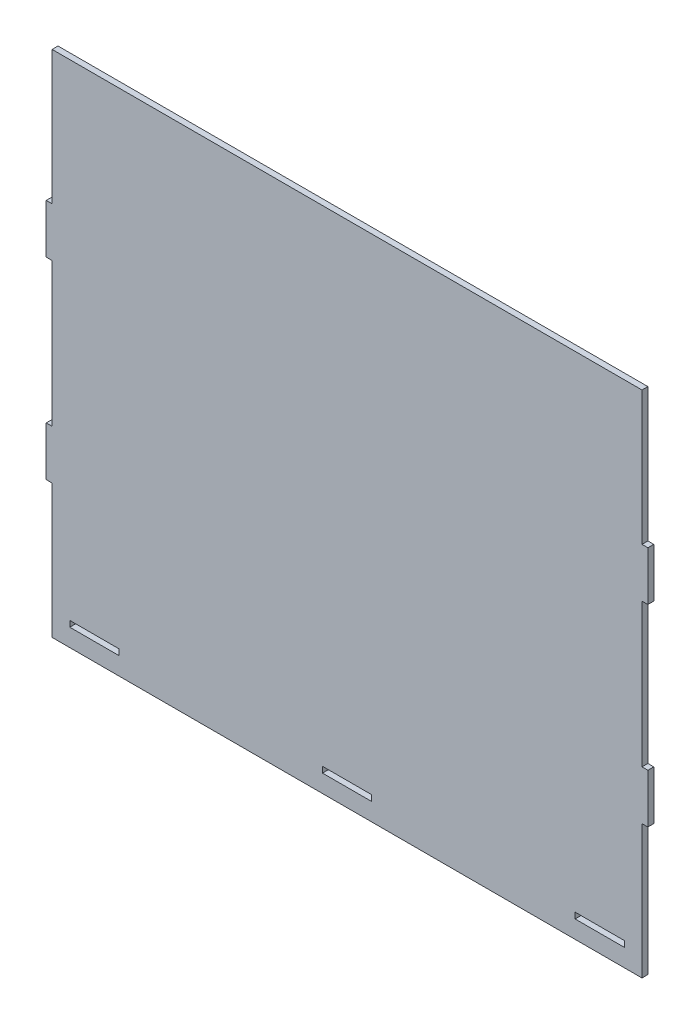
ISO-10303-21;
HEADER;
FILE_DESCRIPTION(('STEP AP214'),'2;1');
FILE_NAME('part.step','',(''),(''),'','','');
FILE_SCHEMA(('AUTOMOTIVE_DESIGN { 1 0 10303 214 1 1 1 1 }'));
ENDSEC;
DATA;
#1=APPLICATION_CONTEXT('core data for automotive mechanical design processes');
#2=APPLICATION_PROTOCOL_DEFINITION('international standard','automotive_design',2000,#1);
#3=PRODUCT_CONTEXT('',#1,'mechanical');
#4=PRODUCT('Part','Part','',(#3));
#5=PRODUCT_RELATED_PRODUCT_CATEGORY('part','',(#4));
#6=PRODUCT_DEFINITION_FORMATION('','',#4);
#7=PRODUCT_DEFINITION_CONTEXT('part definition',#1,'design');
#8=PRODUCT_DEFINITION('design','',#6,#7);
#9=PRODUCT_DEFINITION_SHAPE('','',#8);
#10=(LENGTH_UNIT() NAMED_UNIT(*) SI_UNIT(.MILLI.,.METRE.));
#11=(NAMED_UNIT(*) PLANE_ANGLE_UNIT() SI_UNIT($,.RADIAN.));
#12=(NAMED_UNIT(*) SI_UNIT($,.STERADIAN.) SOLID_ANGLE_UNIT());
#13=UNCERTAINTY_MEASURE_WITH_UNIT(LENGTH_MEASURE(1.E-05),#10,'distance_accuracy_value','');
#14=(GEOMETRIC_REPRESENTATION_CONTEXT(3) GLOBAL_UNCERTAINTY_ASSIGNED_CONTEXT((#13)) GLOBAL_UNIT_ASSIGNED_CONTEXT((#10,
#11,#12)) REPRESENTATION_CONTEXT('',''));
#15=CARTESIAN_POINT('',(0.,0.,0.));
#16=DIRECTION('',(0.,0.,1.));
#17=DIRECTION('',(1.,0.,0.));
#18=AXIS2_PLACEMENT_3D('',#15,#16,#17);
#19=CARTESIAN_POINT('',(0.,0.,6.));
#20=DIRECTION('',(0.,0.,1.));
#21=DIRECTION('',(1.,0.,0.));
#22=AXIS2_PLACEMENT_3D('',#19,#20,#21);
#23=PLANE('',#22);
#24=DIRECTION('',(0.,1.,0.));
#25=VECTOR('',#24,1.);
#26=CARTESIAN_POINT('',(300.,-123.,6.));
#27=LINE('',#26,#25);
#28=CARTESIAN_POINT('',(300.,-259.,6.));
#29=VERTEX_POINT('',#28);
#30=CARTESIAN_POINT('',(300.,-123.,6.));
#31=VERTEX_POINT('',#30);
#32=EDGE_CURVE('E340',#29,#31,#27,.T.);
#33=ORIENTED_EDGE('',*,*,#32,.T.);
#34=DIRECTION('',(1.,0.,0.));
#35=VECTOR('',#34,1.);
#36=CARTESIAN_POINT('',(306.,-123.,6.));
#37=LINE('',#36,#35);
#38=CARTESIAN_POINT('',(306.,-123.,6.));
#39=VERTEX_POINT('',#38);
#40=EDGE_CURVE('E343',#31,#39,#37,.T.);
#41=ORIENTED_EDGE('',*,*,#40,.T.);
#42=DIRECTION('',(0.,1.,0.));
#43=VECTOR('',#42,1.);
#44=CARTESIAN_POINT('',(306.,-123.,6.));
#45=LINE('',#44,#43);
#46=CARTESIAN_POINT('',(306.,-73.0000000000001,6.));
#47=VERTEX_POINT('',#46);
#48=EDGE_CURVE('E346',#39,#47,#45,.T.);
#49=ORIENTED_EDGE('',*,*,#48,.T.);
#50=DIRECTION('',(-1.,0.,0.));
#51=VECTOR('',#50,1.);
#52=CARTESIAN_POINT('',(306.,-73.0000000000001,6.));
#53=LINE('',#52,#51);
#54=CARTESIAN_POINT('',(300.,-73.0000000000002,6.));
#55=VERTEX_POINT('',#54);
#56=EDGE_CURVE('E348',#47,#55,#53,.T.);
#57=ORIENTED_EDGE('',*,*,#56,.T.);
#58=DIRECTION('',(0.,1.,0.));
#59=VECTOR('',#58,1.);
#60=CARTESIAN_POINT('',(300.,73.0000000000001,6.));
#61=LINE('',#60,#59);
#62=CARTESIAN_POINT('',(300.,73.0000000000001,6.));
#63=VERTEX_POINT('',#62);
#64=EDGE_CURVE('E350',#55,#63,#61,.T.);
#65=ORIENTED_EDGE('',*,*,#64,.T.);
#66=DIRECTION('',(1.,0.,0.));
#67=VECTOR('',#66,1.);
#68=CARTESIAN_POINT('',(306.,73.0000000000001,6.));
#69=LINE('',#68,#67);
#70=CARTESIAN_POINT('',(306.,73.0000000000001,6.));
#71=VERTEX_POINT('',#70);
#72=EDGE_CURVE('E352',#63,#71,#69,.T.);
#73=ORIENTED_EDGE('',*,*,#72,.T.);
#74=DIRECTION('',(0.,1.,0.));
#75=VECTOR('',#74,1.);
#76=CARTESIAN_POINT('',(306.,123.,6.));
#77=LINE('',#76,#75);
#78=CARTESIAN_POINT('',(306.,123.,6.));
#79=VERTEX_POINT('',#78);
#80=EDGE_CURVE('E354',#71,#79,#77,.T.);
#81=ORIENTED_EDGE('',*,*,#80,.T.);
#82=DIRECTION('',(-1.,0.,0.));
#83=VECTOR('',#82,1.);
#84=CARTESIAN_POINT('',(306.,123.,6.));
#85=LINE('',#84,#83);
#86=CARTESIAN_POINT('',(300.,123.,6.));
#87=VERTEX_POINT('',#86);
#88=EDGE_CURVE('E356',#79,#87,#85,.T.);
#89=ORIENTED_EDGE('',*,*,#88,.T.);
#90=DIRECTION('',(0.,1.,0.));
#91=VECTOR('',#90,1.);
#92=CARTESIAN_POINT('',(300.,259.,6.));
#93=LINE('',#92,#91);
#94=CARTESIAN_POINT('',(300.,259.,6.));
#95=VERTEX_POINT('',#94);
#96=EDGE_CURVE('E358',#87,#95,#93,.T.);
#97=ORIENTED_EDGE('',*,*,#96,.T.);
#98=DIRECTION('',(-1.,0.,0.));
#99=VECTOR('',#98,1.);
#100=CARTESIAN_POINT('',(-300.,259.,6.));
#101=LINE('',#100,#99);
#102=CARTESIAN_POINT('',(-300.,259.,6.));
#103=VERTEX_POINT('',#102);
#104=EDGE_CURVE('E360',#95,#103,#101,.T.);
#105=ORIENTED_EDGE('',*,*,#104,.T.);
#106=DIRECTION('',(0.,-1.,0.));
#107=VECTOR('',#106,1.);
#108=CARTESIAN_POINT('',(-300.,259.,6.));
#109=LINE('',#108,#107);
#110=CARTESIAN_POINT('',(-300.,123.,6.));
#111=VERTEX_POINT('',#110);
#112=EDGE_CURVE('E362',#103,#111,#109,.T.);
#113=ORIENTED_EDGE('',*,*,#112,.T.);
#114=DIRECTION('',(-1.,0.,0.));
#115=VECTOR('',#114,1.);
#116=CARTESIAN_POINT('',(-306.,123.,6.));
#117=LINE('',#116,#115);
#118=CARTESIAN_POINT('',(-306.,123.,6.));
#119=VERTEX_POINT('',#118);
#120=EDGE_CURVE('E364',#111,#119,#117,.T.);
#121=ORIENTED_EDGE('',*,*,#120,.T.);
#122=DIRECTION('',(0.,-1.,0.));
#123=VECTOR('',#122,1.);
#124=CARTESIAN_POINT('',(-306.,123.,6.));
#125=LINE('',#124,#123);
#126=CARTESIAN_POINT('',(-306.,73.0000000000001,6.));
#127=VERTEX_POINT('',#126);
#128=EDGE_CURVE('E366',#119,#127,#125,.T.);
#129=ORIENTED_EDGE('',*,*,#128,.T.);
#130=DIRECTION('',(1.,0.,0.));
#131=VECTOR('',#130,1.);
#132=CARTESIAN_POINT('',(-306.,73.0000000000001,6.));
#133=LINE('',#132,#131);
#134=CARTESIAN_POINT('',(-300.,73.0000000000001,6.));
#135=VERTEX_POINT('',#134);
#136=EDGE_CURVE('E368',#127,#135,#133,.T.);
#137=ORIENTED_EDGE('',*,*,#136,.T.);
#138=DIRECTION('',(0.,-1.,0.));
#139=VECTOR('',#138,1.);
#140=CARTESIAN_POINT('',(-300.,73.0000000000001,6.));
#141=LINE('',#140,#139);
#142=CARTESIAN_POINT('',(-300.,-73.0000000000002,6.));
#143=VERTEX_POINT('',#142);
#144=EDGE_CURVE('E370',#135,#143,#141,.T.);
#145=ORIENTED_EDGE('',*,*,#144,.T.);
#146=DIRECTION('',(-1.,0.,0.));
#147=VECTOR('',#146,1.);
#148=CARTESIAN_POINT('',(-306.,-73.0000000000002,6.));
#149=LINE('',#148,#147);
#150=CARTESIAN_POINT('',(-306.,-73.0000000000002,6.));
#151=VERTEX_POINT('',#150);
#152=EDGE_CURVE('E372',#143,#151,#149,.T.);
#153=ORIENTED_EDGE('',*,*,#152,.T.);
#154=DIRECTION('',(0.,-1.,0.));
#155=VECTOR('',#154,1.);
#156=CARTESIAN_POINT('',(-306.,-123.,6.));
#157=LINE('',#156,#155);
#158=CARTESIAN_POINT('',(-306.,-123.,6.));
#159=VERTEX_POINT('',#158);
#160=EDGE_CURVE('E374',#151,#159,#157,.T.);
#161=ORIENTED_EDGE('',*,*,#160,.T.);
#162=DIRECTION('',(1.,0.,0.));
#163=VECTOR('',#162,1.);
#164=CARTESIAN_POINT('',(-306.,-123.,6.));
#165=LINE('',#164,#163);
#166=CARTESIAN_POINT('',(-300.,-123.,6.));
#167=VERTEX_POINT('',#166);
#168=EDGE_CURVE('E376',#159,#167,#165,.T.);
#169=ORIENTED_EDGE('',*,*,#168,.T.);
#170=DIRECTION('',(0.,-1.,0.));
#171=VECTOR('',#170,1.);
#172=CARTESIAN_POINT('',(-300.,-123.,6.));
#173=LINE('',#172,#171);
#174=CARTESIAN_POINT('',(-300.,-259.,6.));
#175=VERTEX_POINT('',#174);
#176=EDGE_CURVE('E378',#167,#175,#173,.T.);
#177=ORIENTED_EDGE('',*,*,#176,.T.);
#178=DIRECTION('',(1.,0.,0.));
#179=VECTOR('',#178,1.);
#180=CARTESIAN_POINT('',(-300.,-259.,6.));
#181=LINE('',#180,#179);
#182=EDGE_CURVE('E380',#175,#29,#181,.T.);
#183=ORIENTED_EDGE('',*,*,#182,.T.);
#184=EDGE_LOOP('',(#33,#41,#49,#57,#65,#73,#81,#89,#97,#105,#113,#121,#129,#137,#145,#153,#161,
#169,#177,#183));
#185=FACE_BOUND('',#184,.T.);
#186=DIRECTION('',(-1.,0.,0.));
#187=VECTOR('',#186,1.);
#188=CARTESIAN_POINT('',(-282.,-235.,6.));
#189=LINE('',#188,#187);
#190=CARTESIAN_POINT('',(-232.,-235.,6.));
#191=VERTEX_POINT('',#190);
#192=CARTESIAN_POINT('',(-282.,-235.,6.));
#193=VERTEX_POINT('',#192);
#194=EDGE_CURVE('E311',#191,#193,#189,.T.);
#195=ORIENTED_EDGE('',*,*,#194,.F.);
#196=DIRECTION('',(0.,1.,0.));
#197=VECTOR('',#196,1.);
#198=CARTESIAN_POINT('',(-232.,-235.,6.));
#199=LINE('',#198,#197);
#200=CARTESIAN_POINT('',(-232.,-241.,6.));
#201=VERTEX_POINT('',#200);
#202=EDGE_CURVE('E309',#201,#191,#199,.T.);
#203=ORIENTED_EDGE('',*,*,#202,.F.);
#204=DIRECTION('',(1.,0.,0.));
#205=VECTOR('',#204,1.);
#206=CARTESIAN_POINT('',(-282.,-241.,6.));
#207=LINE('',#206,#205);
#208=CARTESIAN_POINT('',(-282.,-241.,6.));
#209=VERTEX_POINT('',#208);
#210=EDGE_CURVE('E317',#209,#201,#207,.T.);
#211=ORIENTED_EDGE('',*,*,#210,.F.);
#212=DIRECTION('',(0.,-1.,0.));
#213=VECTOR('',#212,1.);
#214=CARTESIAN_POINT('',(-282.,-235.,6.));
#215=LINE('',#214,#213);
#216=EDGE_CURVE('E314',#193,#209,#215,.T.);
#217=ORIENTED_EDGE('',*,*,#216,.F.);
#218=EDGE_LOOP('',(#195,#203,#211,#217));
#219=FACE_BOUND('',#218,.T.);
#220=DIRECTION('',(-1.,0.,0.));
#221=VECTOR('',#220,1.);
#222=CARTESIAN_POINT('',(282.,-235.,6.));
#223=LINE('',#222,#221);
#224=CARTESIAN_POINT('',(282.,-235.,6.));
#225=VERTEX_POINT('',#224);
#226=CARTESIAN_POINT('',(232.,-235.,6.));
#227=VERTEX_POINT('',#226);
#228=EDGE_CURVE('E280',#225,#227,#223,.T.);
#229=ORIENTED_EDGE('',*,*,#228,.F.);
#230=DIRECTION('',(0.,1.,0.));
#231=VECTOR('',#230,1.);
#232=CARTESIAN_POINT('',(282.,-235.,6.));
#233=LINE('',#232,#231);
#234=CARTESIAN_POINT('',(282.,-241.,6.));
#235=VERTEX_POINT('',#234);
#236=EDGE_CURVE('E278',#235,#225,#233,.T.);
#237=ORIENTED_EDGE('',*,*,#236,.F.);
#238=DIRECTION('',(1.,0.,0.));
#239=VECTOR('',#238,1.);
#240=CARTESIAN_POINT('',(282.,-241.,6.));
#241=LINE('',#240,#239);
#242=CARTESIAN_POINT('',(232.,-241.,6.));
#243=VERTEX_POINT('',#242);
#244=EDGE_CURVE('E286',#243,#235,#241,.T.);
#245=ORIENTED_EDGE('',*,*,#244,.F.);
#246=DIRECTION('',(0.,-1.,0.));
#247=VECTOR('',#246,1.);
#248=CARTESIAN_POINT('',(232.,-235.,6.));
#249=LINE('',#248,#247);
#250=EDGE_CURVE('E283',#227,#243,#249,.T.);
#251=ORIENTED_EDGE('',*,*,#250,.F.);
#252=EDGE_LOOP('',(#229,#237,#245,#251));
#253=FACE_BOUND('',#252,.T.);
#254=DIRECTION('',(-1.,0.,0.));
#255=VECTOR('',#254,1.);
#256=CARTESIAN_POINT('',(-24.9999999999998,-235.,6.));
#257=LINE('',#256,#255);
#258=CARTESIAN_POINT('',(25.0000000000002,-235.,6.));
#259=VERTEX_POINT('',#258);
#260=CARTESIAN_POINT('',(-24.9999999999998,-235.,6.));
#261=VERTEX_POINT('',#260);
#262=EDGE_CURVE('E250',#259,#261,#257,.T.);
#263=ORIENTED_EDGE('',*,*,#262,.F.);
#264=DIRECTION('',(0.,1.,0.));
#265=VECTOR('',#264,1.);
#266=CARTESIAN_POINT('',(25.0000000000002,-235.,6.));
#267=LINE('',#266,#265);
#268=CARTESIAN_POINT('',(25.0000000000002,-241.,6.));
#269=VERTEX_POINT('',#268);
#270=EDGE_CURVE('E242',#269,#259,#267,.T.);
#271=ORIENTED_EDGE('',*,*,#270,.F.);
#272=DIRECTION('',(1.,0.,0.));
#273=VECTOR('',#272,1.);
#274=CARTESIAN_POINT('',(-24.9999999999998,-241.,6.));
#275=LINE('',#274,#273);
#276=CARTESIAN_POINT('',(-24.9999999999998,-241.,6.));
#277=VERTEX_POINT('',#276);
#278=EDGE_CURVE('E264',#277,#269,#275,.T.);
#279=ORIENTED_EDGE('',*,*,#278,.F.);
#280=DIRECTION('',(0.,-1.,0.));
#281=VECTOR('',#280,1.);
#282=CARTESIAN_POINT('',(-24.9999999999998,-235.,6.));
#283=LINE('',#282,#281);
#284=EDGE_CURVE('E262',#261,#277,#283,.T.);
#285=ORIENTED_EDGE('',*,*,#284,.F.);
#286=EDGE_LOOP('',(#263,#271,#279,#285));
#287=FACE_BOUND('',#286,.T.);
#288=ADVANCED_FACE('F33',(#185,#219,#253,#287),#23,.T.);
#289=CARTESIAN_POINT('',(0.,0.,0.));
#290=DIRECTION('',(0.,0.,1.));
#291=DIRECTION('',(1.,0.,0.));
#292=AXIS2_PLACEMENT_3D('',#289,#290,#291);
#293=PLANE('',#292);
#294=DIRECTION('',(0.,1.,0.));
#295=VECTOR('',#294,1.);
#296=CARTESIAN_POINT('',(282.,-235.,0.));
#297=LINE('',#296,#295);
#298=CARTESIAN_POINT('',(282.,-241.,0.));
#299=VERTEX_POINT('',#298);
#300=CARTESIAN_POINT('',(282.,-235.,0.));
#301=VERTEX_POINT('',#300);
#302=EDGE_CURVE('E258',#299,#301,#297,.T.);
#303=ORIENTED_EDGE('',*,*,#302,.T.);
#304=DIRECTION('',(-1.,0.,0.));
#305=VECTOR('',#304,1.);
#306=CARTESIAN_POINT('',(282.,-235.,0.));
#307=LINE('',#306,#305);
#308=CARTESIAN_POINT('',(232.,-235.,0.));
#309=VERTEX_POINT('',#308);
#310=EDGE_CURVE('E291',#301,#309,#307,.T.);
#311=ORIENTED_EDGE('',*,*,#310,.T.);
#312=DIRECTION('',(0.,-1.,0.));
#313=VECTOR('',#312,1.);
#314=CARTESIAN_POINT('',(232.,-235.,0.));
#315=LINE('',#314,#313);
#316=CARTESIAN_POINT('',(232.,-241.,0.));
#317=VERTEX_POINT('',#316);
#318=EDGE_CURVE('E294',#309,#317,#315,.T.);
#319=ORIENTED_EDGE('',*,*,#318,.T.);
#320=DIRECTION('',(1.,0.,0.));
#321=VECTOR('',#320,1.);
#322=CARTESIAN_POINT('',(282.,-241.,0.));
#323=LINE('',#322,#321);
#324=EDGE_CURVE('E281',#317,#299,#323,.T.);
#325=ORIENTED_EDGE('',*,*,#324,.T.);
#326=EDGE_LOOP('',(#303,#311,#319,#325));
#327=FACE_BOUND('',#326,.T.);
#328=DIRECTION('',(0.,1.,0.));
#329=VECTOR('',#328,1.);
#330=CARTESIAN_POINT('',(300.,-123.,0.));
#331=LINE('',#330,#329);
#332=CARTESIAN_POINT('',(300.,-259.,0.));
#333=VERTEX_POINT('',#332);
#334=CARTESIAN_POINT('',(300.,-123.,0.));
#335=VERTEX_POINT('',#334);
#336=EDGE_CURVE('E339',#333,#335,#331,.T.);
#337=ORIENTED_EDGE('',*,*,#336,.F.);
#338=DIRECTION('',(1.,0.,0.));
#339=VECTOR('',#338,1.);
#340=CARTESIAN_POINT('',(-300.,-259.,0.));
#341=LINE('',#340,#339);
#342=CARTESIAN_POINT('',(-300.,-259.,0.));
#343=VERTEX_POINT('',#342);
#344=EDGE_CURVE('E344',#343,#333,#341,.T.);
#345=ORIENTED_EDGE('',*,*,#344,.F.);
#346=DIRECTION('',(0.,-1.,0.));
#347=VECTOR('',#346,1.);
#348=CARTESIAN_POINT('',(-300.,-123.,0.));
#349=LINE('',#348,#347);
#350=CARTESIAN_POINT('',(-300.,-123.,0.));
#351=VERTEX_POINT('',#350);
#352=EDGE_CURVE('E419',#351,#343,#349,.T.);
#353=ORIENTED_EDGE('',*,*,#352,.F.);
#354=DIRECTION('',(1.,0.,0.));
#355=VECTOR('',#354,1.);
#356=CARTESIAN_POINT('',(-306.,-123.,0.));
#357=LINE('',#356,#355);
#358=CARTESIAN_POINT('',(-306.,-123.,0.));
#359=VERTEX_POINT('',#358);
#360=EDGE_CURVE('E417',#359,#351,#357,.T.);
#361=ORIENTED_EDGE('',*,*,#360,.F.);
#362=DIRECTION('',(0.,-1.,0.));
#363=VECTOR('',#362,1.);
#364=CARTESIAN_POINT('',(-306.,-123.,0.));
#365=LINE('',#364,#363);
#366=CARTESIAN_POINT('',(-306.,-73.0000000000002,0.));
#367=VERTEX_POINT('',#366);
#368=EDGE_CURVE('E415',#367,#359,#365,.T.);
#369=ORIENTED_EDGE('',*,*,#368,.F.);
#370=DIRECTION('',(-1.,0.,0.));
#371=VECTOR('',#370,1.);
#372=CARTESIAN_POINT('',(-306.,-73.0000000000002,0.));
#373=LINE('',#372,#371);
#374=CARTESIAN_POINT('',(-300.,-73.0000000000002,0.));
#375=VERTEX_POINT('',#374);
#376=EDGE_CURVE('E413',#375,#367,#373,.T.);
#377=ORIENTED_EDGE('',*,*,#376,.F.);
#378=DIRECTION('',(0.,-1.,0.));
#379=VECTOR('',#378,1.);
#380=CARTESIAN_POINT('',(-300.,73.0000000000001,0.));
#381=LINE('',#380,#379);
#382=CARTESIAN_POINT('',(-300.,73.0000000000001,0.));
#383=VERTEX_POINT('',#382);
#384=EDGE_CURVE('E411',#383,#375,#381,.T.);
#385=ORIENTED_EDGE('',*,*,#384,.F.);
#386=DIRECTION('',(1.,0.,0.));
#387=VECTOR('',#386,1.);
#388=CARTESIAN_POINT('',(-306.,73.0000000000001,0.));
#389=LINE('',#388,#387);
#390=CARTESIAN_POINT('',(-306.,73.0000000000001,0.));
#391=VERTEX_POINT('',#390);
#392=EDGE_CURVE('E409',#391,#383,#389,.T.);
#393=ORIENTED_EDGE('',*,*,#392,.F.);
#394=DIRECTION('',(0.,-1.,0.));
#395=VECTOR('',#394,1.);
#396=CARTESIAN_POINT('',(-306.,123.,0.));
#397=LINE('',#396,#395);
#398=CARTESIAN_POINT('',(-306.,123.,0.));
#399=VERTEX_POINT('',#398);
#400=EDGE_CURVE('E407',#399,#391,#397,.T.);
#401=ORIENTED_EDGE('',*,*,#400,.F.);
#402=DIRECTION('',(-1.,0.,0.));
#403=VECTOR('',#402,1.);
#404=CARTESIAN_POINT('',(-306.,123.,0.));
#405=LINE('',#404,#403);
#406=CARTESIAN_POINT('',(-300.,123.,0.));
#407=VERTEX_POINT('',#406);
#408=EDGE_CURVE('E405',#407,#399,#405,.T.);
#409=ORIENTED_EDGE('',*,*,#408,.F.);
#410=DIRECTION('',(0.,-1.,0.));
#411=VECTOR('',#410,1.);
#412=CARTESIAN_POINT('',(-300.,259.,0.));
#413=LINE('',#412,#411);
#414=CARTESIAN_POINT('',(-300.,259.,0.));
#415=VERTEX_POINT('',#414);
#416=EDGE_CURVE('E403',#415,#407,#413,.T.);
#417=ORIENTED_EDGE('',*,*,#416,.F.);
#418=DIRECTION('',(-1.,0.,0.));
#419=VECTOR('',#418,1.);
#420=CARTESIAN_POINT('',(-300.,259.,0.));
#421=LINE('',#420,#419);
#422=CARTESIAN_POINT('',(300.,259.,0.));
#423=VERTEX_POINT('',#422);
#424=EDGE_CURVE('E401',#423,#415,#421,.T.);
#425=ORIENTED_EDGE('',*,*,#424,.F.);
#426=DIRECTION('',(0.,1.,0.));
#427=VECTOR('',#426,1.);
#428=CARTESIAN_POINT('',(300.,259.,0.));
#429=LINE('',#428,#427);
#430=CARTESIAN_POINT('',(300.,123.,0.));
#431=VERTEX_POINT('',#430);
#432=EDGE_CURVE('E399',#431,#423,#429,.T.);
#433=ORIENTED_EDGE('',*,*,#432,.F.);
#434=DIRECTION('',(-1.,0.,0.));
#435=VECTOR('',#434,1.);
#436=CARTESIAN_POINT('',(306.,123.,0.));
#437=LINE('',#436,#435);
#438=CARTESIAN_POINT('',(306.,123.,0.));
#439=VERTEX_POINT('',#438);
#440=EDGE_CURVE('E397',#439,#431,#437,.T.);
#441=ORIENTED_EDGE('',*,*,#440,.F.);
#442=DIRECTION('',(0.,1.,0.));
#443=VECTOR('',#442,1.);
#444=CARTESIAN_POINT('',(306.,123.,0.));
#445=LINE('',#444,#443);
#446=CARTESIAN_POINT('',(306.,73.0000000000001,0.));
#447=VERTEX_POINT('',#446);
#448=EDGE_CURVE('E395',#447,#439,#445,.T.);
#449=ORIENTED_EDGE('',*,*,#448,.F.);
#450=DIRECTION('',(1.,0.,0.));
#451=VECTOR('',#450,1.);
#452=CARTESIAN_POINT('',(306.,73.0000000000001,0.));
#453=LINE('',#452,#451);
#454=CARTESIAN_POINT('',(300.,73.0000000000001,0.));
#455=VERTEX_POINT('',#454);
#456=EDGE_CURVE('E393',#455,#447,#453,.T.);
#457=ORIENTED_EDGE('',*,*,#456,.F.);
#458=DIRECTION('',(0.,1.,0.));
#459=VECTOR('',#458,1.);
#460=CARTESIAN_POINT('',(300.,73.0000000000001,0.));
#461=LINE('',#460,#459);
#462=CARTESIAN_POINT('',(300.,-73.0000000000002,0.));
#463=VERTEX_POINT('',#462);
#464=EDGE_CURVE('E391',#463,#455,#461,.T.);
#465=ORIENTED_EDGE('',*,*,#464,.F.);
#466=DIRECTION('',(-1.,0.,0.));
#467=VECTOR('',#466,1.);
#468=CARTESIAN_POINT('',(306.,-73.0000000000001,0.));
#469=LINE('',#468,#467);
#470=CARTESIAN_POINT('',(306.,-73.0000000000001,0.));
#471=VERTEX_POINT('',#470);
#472=EDGE_CURVE('E389',#471,#463,#469,.T.);
#473=ORIENTED_EDGE('',*,*,#472,.F.);
#474=DIRECTION('',(0.,1.,0.));
#475=VECTOR('',#474,1.);
#476=CARTESIAN_POINT('',(306.,-123.,0.));
#477=LINE('',#476,#475);
#478=CARTESIAN_POINT('',(306.,-123.,0.));
#479=VERTEX_POINT('',#478);
#480=EDGE_CURVE('E387',#479,#471,#477,.T.);
#481=ORIENTED_EDGE('',*,*,#480,.F.);
#482=DIRECTION('',(1.,0.,0.));
#483=VECTOR('',#482,1.);
#484=CARTESIAN_POINT('',(306.,-123.,0.));
#485=LINE('',#484,#483);
#486=EDGE_CURVE('E385',#335,#479,#485,.T.);
#487=ORIENTED_EDGE('',*,*,#486,.F.);
#488=EDGE_LOOP('',(#337,#345,#353,#361,#369,#377,#385,#393,#401,#409,#417,#425,#433,#441,#449,
#457,#465,#473,#481,#487));
#489=FACE_BOUND('',#488,.T.);
#490=DIRECTION('',(0.,1.,0.));
#491=VECTOR('',#490,1.);
#492=CARTESIAN_POINT('',(-232.,-235.,0.));
#493=LINE('',#492,#491);
#494=CARTESIAN_POINT('',(-232.,-241.,0.));
#495=VERTEX_POINT('',#494);
#496=CARTESIAN_POINT('',(-232.,-235.,0.));
#497=VERTEX_POINT('',#496);
#498=EDGE_CURVE('E308',#495,#497,#493,.T.);
#499=ORIENTED_EDGE('',*,*,#498,.T.);
#500=DIRECTION('',(-1.,0.,0.));
#501=VECTOR('',#500,1.);
#502=CARTESIAN_POINT('',(-282.,-235.,0.));
#503=LINE('',#502,#501);
#504=CARTESIAN_POINT('',(-282.,-235.,0.));
#505=VERTEX_POINT('',#504);
#506=EDGE_CURVE('E322',#497,#505,#503,.T.);
#507=ORIENTED_EDGE('',*,*,#506,.T.);
#508=DIRECTION('',(0.,-1.,0.));
#509=VECTOR('',#508,1.);
#510=CARTESIAN_POINT('',(-282.,-235.,0.));
#511=LINE('',#510,#509);
#512=CARTESIAN_POINT('',(-282.,-241.,0.));
#513=VERTEX_POINT('',#512);
#514=EDGE_CURVE('E325',#505,#513,#511,.T.);
#515=ORIENTED_EDGE('',*,*,#514,.T.);
#516=DIRECTION('',(1.,0.,0.));
#517=VECTOR('',#516,1.);
#518=CARTESIAN_POINT('',(-282.,-241.,0.));
#519=LINE('',#518,#517);
#520=EDGE_CURVE('E312',#513,#495,#519,.T.);
#521=ORIENTED_EDGE('',*,*,#520,.T.);
#522=EDGE_LOOP('',(#499,#507,#515,#521));
#523=FACE_BOUND('',#522,.T.);
#524=DIRECTION('',(0.,1.,0.));
#525=VECTOR('',#524,1.);
#526=CARTESIAN_POINT('',(25.0000000000002,-235.,0.));
#527=LINE('',#526,#525);
#528=CARTESIAN_POINT('',(25.0000000000002,-241.,0.));
#529=VERTEX_POINT('',#528);
#530=CARTESIAN_POINT('',(25.0000000000002,-235.,0.));
#531=VERTEX_POINT('',#530);
#532=EDGE_CURVE('E56',#529,#531,#527,.T.);
#533=ORIENTED_EDGE('',*,*,#532,.T.);
#534=DIRECTION('',(-1.,0.,0.));
#535=VECTOR('',#534,1.);
#536=CARTESIAN_POINT('',(-24.9999999999998,-235.,0.));
#537=LINE('',#536,#535);
#538=CARTESIAN_POINT('',(-24.9999999999998,-235.,0.));
#539=VERTEX_POINT('',#538);
#540=EDGE_CURVE('E257',#531,#539,#537,.T.);
#541=ORIENTED_EDGE('',*,*,#540,.T.);
#542=DIRECTION('',(0.,-1.,0.));
#543=VECTOR('',#542,1.);
#544=CARTESIAN_POINT('',(-24.9999999999998,-235.,0.));
#545=LINE('',#544,#543);
#546=CARTESIAN_POINT('',(-24.9999999999998,-241.,0.));
#547=VERTEX_POINT('',#546);
#548=EDGE_CURVE('E270',#539,#547,#545,.T.);
#549=ORIENTED_EDGE('',*,*,#548,.T.);
#550=DIRECTION('',(1.,0.,0.));
#551=VECTOR('',#550,1.);
#552=CARTESIAN_POINT('',(-24.9999999999998,-241.,0.));
#553=LINE('',#552,#551);
#554=EDGE_CURVE('E251',#547,#529,#553,.T.);
#555=ORIENTED_EDGE('',*,*,#554,.T.);
#556=EDGE_LOOP('',(#533,#541,#549,#555));
#557=FACE_BOUND('',#556,.T.);
#558=ADVANCED_FACE('F485',(#327,#489,#523,#557),#293,.F.);
#559=CARTESIAN_POINT('',(300.,-123.,6.));
#560=DIRECTION('',(-1.,0.,0.));
#561=DIRECTION('',(0.,-1.,0.));
#562=AXIS2_PLACEMENT_3D('',#559,#560,#561);
#563=PLANE('',#562);
#564=ORIENTED_EDGE('',*,*,#336,.T.);
#565=DIRECTION('',(0.,0.,-1.));
#566=VECTOR('',#565,1.);
#567=CARTESIAN_POINT('',(300.,-123.,6.));
#568=LINE('',#567,#566);
#569=EDGE_CURVE('E11',#31,#335,#568,.T.);
#570=ORIENTED_EDGE('',*,*,#569,.F.);
#571=ORIENTED_EDGE('',*,*,#32,.F.);
#572=DIRECTION('',(0.,0.,-1.));
#573=VECTOR('',#572,1.);
#574=CARTESIAN_POINT('',(300.,-259.,6.));
#575=LINE('',#574,#573);
#576=EDGE_CURVE('E382',#29,#333,#575,.T.);
#577=ORIENTED_EDGE('',*,*,#576,.T.);
#578=EDGE_LOOP('',(#564,#570,#571,#577));
#579=FACE_BOUND('',#578,.T.);
#580=ADVANCED_FACE('F35',(#579),#563,.F.);
#581=CARTESIAN_POINT('',(306.,-123.,6.));
#582=DIRECTION('',(0.,1.,0.));
#583=DIRECTION('',(-1.,0.,0.));
#584=AXIS2_PLACEMENT_3D('',#581,#582,#583);
#585=PLANE('',#584);
#586=ORIENTED_EDGE('',*,*,#486,.T.);
#587=DIRECTION('',(0.,0.,-1.));
#588=VECTOR('',#587,1.);
#589=CARTESIAN_POINT('',(306.,-123.,6.));
#590=LINE('',#589,#588);
#591=EDGE_CURVE('E41',#39,#479,#590,.T.);
#592=ORIENTED_EDGE('',*,*,#591,.F.);
#593=ORIENTED_EDGE('',*,*,#40,.F.);
#594=ORIENTED_EDGE('',*,*,#569,.T.);
#595=EDGE_LOOP('',(#586,#592,#593,#594));
#596=FACE_BOUND('',#595,.T.);
#597=ADVANCED_FACE('F503',(#596),#585,.F.);
#598=CARTESIAN_POINT('',(306.,-123.,6.));
#599=DIRECTION('',(-1.,0.,0.));
#600=DIRECTION('',(0.,0.,1.));
#601=AXIS2_PLACEMENT_3D('',#598,#599,#600);
#602=PLANE('',#601);
#603=ORIENTED_EDGE('',*,*,#480,.T.);
#604=DIRECTION('',(0.,0.,-1.));
#605=VECTOR('',#604,1.);
#606=CARTESIAN_POINT('',(306.,-73.0000000000001,6.));
#607=LINE('',#606,#605);
#608=EDGE_CURVE('E472',#47,#471,#607,.T.);
#609=ORIENTED_EDGE('',*,*,#608,.F.);
#610=ORIENTED_EDGE('',*,*,#48,.F.);
#611=ORIENTED_EDGE('',*,*,#591,.T.);
#612=EDGE_LOOP('',(#603,#609,#610,#611));
#613=FACE_BOUND('',#612,.T.);
#614=ADVANCED_FACE('F479',(#613),#602,.F.);
#615=CARTESIAN_POINT('',(306.,-73.0000000000001,6.));
#616=DIRECTION('',(0.,-1.,0.));
#617=DIRECTION('',(1.,0.,0.));
#618=AXIS2_PLACEMENT_3D('',#615,#616,#617);
#619=PLANE('',#618);
#620=ORIENTED_EDGE('',*,*,#472,.T.);
#621=DIRECTION('',(0.,0.,-1.));
#622=VECTOR('',#621,1.);
#623=CARTESIAN_POINT('',(300.,-73.0000000000002,6.));
#624=LINE('',#623,#622);
#625=EDGE_CURVE('E469',#55,#463,#624,.T.);
#626=ORIENTED_EDGE('',*,*,#625,.F.);
#627=ORIENTED_EDGE('',*,*,#56,.F.);
#628=ORIENTED_EDGE('',*,*,#608,.T.);
#629=EDGE_LOOP('',(#620,#626,#627,#628));
#630=FACE_BOUND('',#629,.T.);
#631=ADVANCED_FACE('F491',(#630),#619,.F.);
#632=CARTESIAN_POINT('',(300.,73.0000000000001,6.));
#633=DIRECTION('',(-1.,0.,0.));
#634=DIRECTION('',(0.,0.,1.));
#635=AXIS2_PLACEMENT_3D('',#632,#633,#634);
#636=PLANE('',#635);
#637=ORIENTED_EDGE('',*,*,#464,.T.);
#638=DIRECTION('',(0.,0.,-1.));
#639=VECTOR('',#638,1.);
#640=CARTESIAN_POINT('',(300.,73.0000000000001,6.));
#641=LINE('',#640,#639);
#642=EDGE_CURVE('E466',#63,#455,#641,.T.);
#643=ORIENTED_EDGE('',*,*,#642,.F.);
#644=ORIENTED_EDGE('',*,*,#64,.F.);
#645=ORIENTED_EDGE('',*,*,#625,.T.);
#646=EDGE_LOOP('',(#637,#643,#644,#645));
#647=FACE_BOUND('',#646,.T.);
#648=ADVANCED_FACE('F495',(#647),#636,.F.);
#649=CARTESIAN_POINT('',(306.,73.0000000000001,6.));
#650=DIRECTION('',(0.,1.,0.));
#651=DIRECTION('',(-1.,0.,0.));
#652=AXIS2_PLACEMENT_3D('',#649,#650,#651);
#653=PLANE('',#652);
#654=ORIENTED_EDGE('',*,*,#456,.T.);
#655=DIRECTION('',(0.,0.,-1.));
#656=VECTOR('',#655,1.);
#657=CARTESIAN_POINT('',(306.,73.0000000000001,6.));
#658=LINE('',#657,#656);
#659=EDGE_CURVE('E463',#71,#447,#658,.T.);
#660=ORIENTED_EDGE('',*,*,#659,.F.);
#661=ORIENTED_EDGE('',*,*,#72,.F.);
#662=ORIENTED_EDGE('',*,*,#642,.T.);
#663=EDGE_LOOP('',(#654,#660,#661,#662));
#664=FACE_BOUND('',#663,.T.);
#665=ADVANCED_FACE('F576',(#664),#653,.F.);
#666=CARTESIAN_POINT('',(306.,123.,6.));
#667=DIRECTION('',(-1.,0.,0.));
#668=DIRECTION('',(0.,0.,1.));
#669=AXIS2_PLACEMENT_3D('',#666,#667,#668);
#670=PLANE('',#669);
#671=ORIENTED_EDGE('',*,*,#448,.T.);
#672=DIRECTION('',(0.,0.,-1.));
#673=VECTOR('',#672,1.);
#674=CARTESIAN_POINT('',(306.,123.,6.));
#675=LINE('',#674,#673);
#676=EDGE_CURVE('E460',#79,#439,#675,.T.);
#677=ORIENTED_EDGE('',*,*,#676,.F.);
#678=ORIENTED_EDGE('',*,*,#80,.F.);
#679=ORIENTED_EDGE('',*,*,#659,.T.);
#680=EDGE_LOOP('',(#671,#677,#678,#679));
#681=FACE_BOUND('',#680,.T.);
#682=ADVANCED_FACE('F574',(#681),#670,.F.);
#683=CARTESIAN_POINT('',(306.,123.,6.));
#684=DIRECTION('',(0.,-1.,0.));
#685=DIRECTION('',(1.,0.,0.));
#686=AXIS2_PLACEMENT_3D('',#683,#684,#685);
#687=PLANE('',#686);
#688=ORIENTED_EDGE('',*,*,#440,.T.);
#689=DIRECTION('',(0.,0.,-1.));
#690=VECTOR('',#689,1.);
#691=CARTESIAN_POINT('',(300.,123.,6.));
#692=LINE('',#691,#690);
#693=EDGE_CURVE('E457',#87,#431,#692,.T.);
#694=ORIENTED_EDGE('',*,*,#693,.F.);
#695=ORIENTED_EDGE('',*,*,#88,.F.);
#696=ORIENTED_EDGE('',*,*,#676,.T.);
#697=EDGE_LOOP('',(#688,#694,#695,#696));
#698=FACE_BOUND('',#697,.T.);
#699=ADVANCED_FACE('F569',(#698),#687,.F.);
#700=CARTESIAN_POINT('',(300.,259.,6.));
#701=DIRECTION('',(-1.,0.,0.));
#702=DIRECTION('',(0.,0.,1.));
#703=AXIS2_PLACEMENT_3D('',#700,#701,#702);
#704=PLANE('',#703);
#705=ORIENTED_EDGE('',*,*,#432,.T.);
#706=DIRECTION('',(0.,0.,-1.));
#707=VECTOR('',#706,1.);
#708=CARTESIAN_POINT('',(300.,259.,6.));
#709=LINE('',#708,#707);
#710=EDGE_CURVE('E454',#95,#423,#709,.T.);
#711=ORIENTED_EDGE('',*,*,#710,.F.);
#712=ORIENTED_EDGE('',*,*,#96,.F.);
#713=ORIENTED_EDGE('',*,*,#693,.T.);
#714=EDGE_LOOP('',(#705,#711,#712,#713));
#715=FACE_BOUND('',#714,.T.);
#716=ADVANCED_FACE('F564',(#715),#704,.F.);
#717=CARTESIAN_POINT('',(-300.,259.,6.));
#718=DIRECTION('',(0.,-1.,0.));
#719=DIRECTION('',(1.,0.,0.));
#720=AXIS2_PLACEMENT_3D('',#717,#718,#719);
#721=PLANE('',#720);
#722=ORIENTED_EDGE('',*,*,#424,.T.);
#723=DIRECTION('',(0.,0.,-1.));
#724=VECTOR('',#723,1.);
#725=CARTESIAN_POINT('',(-300.,259.,6.));
#726=LINE('',#725,#724);
#727=EDGE_CURVE('E451',#103,#415,#726,.T.);
#728=ORIENTED_EDGE('',*,*,#727,.F.);
#729=ORIENTED_EDGE('',*,*,#104,.F.);
#730=ORIENTED_EDGE('',*,*,#710,.T.);
#731=EDGE_LOOP('',(#722,#728,#729,#730));
#732=FACE_BOUND('',#731,.T.);
#733=ADVANCED_FACE('F560',(#732),#721,.F.);
#734=CARTESIAN_POINT('',(-300.,259.,6.));
#735=DIRECTION('',(1.,0.,0.));
#736=DIRECTION('',(0.,1.,0.));
#737=AXIS2_PLACEMENT_3D('',#734,#735,#736);
#738=PLANE('',#737);
#739=ORIENTED_EDGE('',*,*,#416,.T.);
#740=DIRECTION('',(0.,0.,-1.));
#741=VECTOR('',#740,1.);
#742=CARTESIAN_POINT('',(-300.,123.,6.));
#743=LINE('',#742,#741);
#744=EDGE_CURVE('E448',#111,#407,#743,.T.);
#745=ORIENTED_EDGE('',*,*,#744,.F.);
#746=ORIENTED_EDGE('',*,*,#112,.F.);
#747=ORIENTED_EDGE('',*,*,#727,.T.);
#748=EDGE_LOOP('',(#739,#745,#746,#747));
#749=FACE_BOUND('',#748,.T.);
#750=ADVANCED_FACE('F555',(#749),#738,.F.);
#751=CARTESIAN_POINT('',(-306.,123.,6.));
#752=DIRECTION('',(0.,-1.,0.));
#753=DIRECTION('',(0.,0.,-1.));
#754=AXIS2_PLACEMENT_3D('',#751,#752,#753);
#755=PLANE('',#754);
#756=ORIENTED_EDGE('',*,*,#408,.T.);
#757=DIRECTION('',(0.,0.,-1.));
#758=VECTOR('',#757,1.);
#759=CARTESIAN_POINT('',(-306.,123.,6.));
#760=LINE('',#759,#758);
#761=EDGE_CURVE('E445',#119,#399,#760,.T.);
#762=ORIENTED_EDGE('',*,*,#761,.F.);
#763=ORIENTED_EDGE('',*,*,#120,.F.);
#764=ORIENTED_EDGE('',*,*,#744,.T.);
#765=EDGE_LOOP('',(#756,#762,#763,#764));
#766=FACE_BOUND('',#765,.T.);
#767=ADVANCED_FACE('F549',(#766),#755,.F.);
#768=CARTESIAN_POINT('',(-306.,123.,6.));
#769=DIRECTION('',(1.,0.,0.));
#770=DIRECTION('',(0.,0.,-1.));
#771=AXIS2_PLACEMENT_3D('',#768,#769,#770);
#772=PLANE('',#771);
#773=ORIENTED_EDGE('',*,*,#400,.T.);
#774=DIRECTION('',(0.,0.,-1.));
#775=VECTOR('',#774,1.);
#776=CARTESIAN_POINT('',(-306.,73.0000000000001,6.));
#777=LINE('',#776,#775);
#778=EDGE_CURVE('E442',#127,#391,#777,.T.);
#779=ORIENTED_EDGE('',*,*,#778,.F.);
#780=ORIENTED_EDGE('',*,*,#128,.F.);
#781=ORIENTED_EDGE('',*,*,#761,.T.);
#782=EDGE_LOOP('',(#773,#779,#780,#781));
#783=FACE_BOUND('',#782,.T.);
#784=ADVANCED_FACE('F545',(#783),#772,.F.);
#785=CARTESIAN_POINT('',(-306.,73.0000000000001,6.));
#786=DIRECTION('',(0.,1.,0.));
#787=DIRECTION('',(0.,0.,1.));
#788=AXIS2_PLACEMENT_3D('',#785,#786,#787);
#789=PLANE('',#788);
#790=ORIENTED_EDGE('',*,*,#392,.T.);
#791=DIRECTION('',(0.,0.,-1.));
#792=VECTOR('',#791,1.);
#793=CARTESIAN_POINT('',(-300.,73.0000000000001,6.));
#794=LINE('',#793,#792);
#795=EDGE_CURVE('E439',#135,#383,#794,.T.);
#796=ORIENTED_EDGE('',*,*,#795,.F.);
#797=ORIENTED_EDGE('',*,*,#136,.F.);
#798=ORIENTED_EDGE('',*,*,#778,.T.);
#799=EDGE_LOOP('',(#790,#796,#797,#798));
#800=FACE_BOUND('',#799,.T.);
#801=ADVANCED_FACE('F540',(#800),#789,.F.);
#802=CARTESIAN_POINT('',(-300.,73.0000000000001,6.));
#803=DIRECTION('',(1.,0.,0.));
#804=DIRECTION('',(0.,0.,-1.));
#805=AXIS2_PLACEMENT_3D('',#802,#803,#804);
#806=PLANE('',#805);
#807=ORIENTED_EDGE('',*,*,#384,.T.);
#808=DIRECTION('',(0.,0.,-1.));
#809=VECTOR('',#808,1.);
#810=CARTESIAN_POINT('',(-300.,-73.0000000000002,6.));
#811=LINE('',#810,#809);
#812=EDGE_CURVE('E436',#143,#375,#811,.T.);
#813=ORIENTED_EDGE('',*,*,#812,.F.);
#814=ORIENTED_EDGE('',*,*,#144,.F.);
#815=ORIENTED_EDGE('',*,*,#795,.T.);
#816=EDGE_LOOP('',(#807,#813,#814,#815));
#817=FACE_BOUND('',#816,.T.);
#818=ADVANCED_FACE('F534',(#817),#806,.F.);
#819=CARTESIAN_POINT('',(-306.,-73.0000000000002,6.));
#820=DIRECTION('',(0.,-1.,0.));
#821=DIRECTION('',(1.,0.,0.));
#822=AXIS2_PLACEMENT_3D('',#819,#820,#821);
#823=PLANE('',#822);
#824=ORIENTED_EDGE('',*,*,#376,.T.);
#825=DIRECTION('',(0.,0.,-1.));
#826=VECTOR('',#825,1.);
#827=CARTESIAN_POINT('',(-306.,-73.0000000000002,6.));
#828=LINE('',#827,#826);
#829=EDGE_CURVE('E433',#151,#367,#828,.T.);
#830=ORIENTED_EDGE('',*,*,#829,.F.);
#831=ORIENTED_EDGE('',*,*,#152,.F.);
#832=ORIENTED_EDGE('',*,*,#812,.T.);
#833=EDGE_LOOP('',(#824,#830,#831,#832));
#834=FACE_BOUND('',#833,.T.);
#835=ADVANCED_FACE('F530',(#834),#823,.F.);
#836=CARTESIAN_POINT('',(-306.,-123.,6.));
#837=DIRECTION('',(1.,0.,0.));
#838=DIRECTION('',(0.,0.,-1.));
#839=AXIS2_PLACEMENT_3D('',#836,#837,#838);
#840=PLANE('',#839);
#841=ORIENTED_EDGE('',*,*,#368,.T.);
#842=DIRECTION('',(0.,0.,-1.));
#843=VECTOR('',#842,1.);
#844=CARTESIAN_POINT('',(-306.,-123.,6.));
#845=LINE('',#844,#843);
#846=EDGE_CURVE('E430',#159,#359,#845,.T.);
#847=ORIENTED_EDGE('',*,*,#846,.F.);
#848=ORIENTED_EDGE('',*,*,#160,.F.);
#849=ORIENTED_EDGE('',*,*,#829,.T.);
#850=EDGE_LOOP('',(#841,#847,#848,#849));
#851=FACE_BOUND('',#850,.T.);
#852=ADVANCED_FACE('F525',(#851),#840,.F.);
#853=CARTESIAN_POINT('',(-306.,-123.,6.));
#854=DIRECTION('',(0.,1.,0.));
#855=DIRECTION('',(-1.,0.,0.));
#856=AXIS2_PLACEMENT_3D('',#853,#854,#855);
#857=PLANE('',#856);
#858=ORIENTED_EDGE('',*,*,#360,.T.);
#859=DIRECTION('',(0.,0.,-1.));
#860=VECTOR('',#859,1.);
#861=CARTESIAN_POINT('',(-300.,-123.,6.));
#862=LINE('',#861,#860);
#863=EDGE_CURVE('E427',#167,#351,#862,.T.);
#864=ORIENTED_EDGE('',*,*,#863,.F.);
#865=ORIENTED_EDGE('',*,*,#168,.F.);
#866=ORIENTED_EDGE('',*,*,#846,.T.);
#867=EDGE_LOOP('',(#858,#864,#865,#866));
#868=FACE_BOUND('',#867,.T.);
#869=ADVANCED_FACE('F519',(#868),#857,.F.);
#870=CARTESIAN_POINT('',(-300.,-123.,6.));
#871=DIRECTION('',(1.,0.,0.));
#872=DIRECTION('',(0.,1.,0.));
#873=AXIS2_PLACEMENT_3D('',#870,#871,#872);
#874=PLANE('',#873);
#875=ORIENTED_EDGE('',*,*,#352,.T.);
#876=DIRECTION('',(0.,0.,-1.));
#877=VECTOR('',#876,1.);
#878=CARTESIAN_POINT('',(-300.,-259.,6.));
#879=LINE('',#878,#877);
#880=EDGE_CURVE('E424',#175,#343,#879,.T.);
#881=ORIENTED_EDGE('',*,*,#880,.F.);
#882=ORIENTED_EDGE('',*,*,#176,.F.);
#883=ORIENTED_EDGE('',*,*,#863,.T.);
#884=EDGE_LOOP('',(#875,#881,#882,#883));
#885=FACE_BOUND('',#884,.T.);
#886=ADVANCED_FACE('F515',(#885),#874,.F.);
#887=CARTESIAN_POINT('',(-300.,-259.,6.));
#888=DIRECTION('',(0.,1.,0.));
#889=DIRECTION('',(-1.,0.,0.));
#890=AXIS2_PLACEMENT_3D('',#887,#888,#889);
#891=PLANE('',#890);
#892=ORIENTED_EDGE('',*,*,#344,.T.);
#893=ORIENTED_EDGE('',*,*,#576,.F.);
#894=ORIENTED_EDGE('',*,*,#182,.F.);
#895=ORIENTED_EDGE('',*,*,#880,.T.);
#896=EDGE_LOOP('',(#892,#893,#894,#895));
#897=FACE_BOUND('',#896,.T.);
#898=ADVANCED_FACE('F510',(#897),#891,.F.);
#899=CARTESIAN_POINT('',(-232.,-235.,6.));
#900=DIRECTION('',(-1.,0.,0.));
#901=DIRECTION('',(0.,-1.,0.));
#902=AXIS2_PLACEMENT_3D('',#899,#900,#901);
#903=PLANE('',#902);
#904=ORIENTED_EDGE('',*,*,#498,.F.);
#905=DIRECTION('',(0.,0.,-1.));
#906=VECTOR('',#905,1.);
#907=CARTESIAN_POINT('',(-232.,-241.,6.));
#908=LINE('',#907,#906);
#909=EDGE_CURVE('E319',#201,#495,#908,.T.);
#910=ORIENTED_EDGE('',*,*,#909,.F.);
#911=ORIENTED_EDGE('',*,*,#202,.T.);
#912=DIRECTION('',(0.,0.,-1.));
#913=VECTOR('',#912,1.);
#914=CARTESIAN_POINT('',(-232.,-235.,6.));
#915=LINE('',#914,#913);
#916=EDGE_CURVE('E336',#191,#497,#915,.T.);
#917=ORIENTED_EDGE('',*,*,#916,.T.);
#918=EDGE_LOOP('',(#904,#910,#911,#917));
#919=FACE_BOUND('',#918,.T.);
#920=ADVANCED_FACE('F593',(#919),#903,.T.);
#921=CARTESIAN_POINT('',(-282.,-235.,6.));
#922=DIRECTION('',(0.,-1.,0.));
#923=DIRECTION('',(1.,0.,0.));
#924=AXIS2_PLACEMENT_3D('',#921,#922,#923);
#925=PLANE('',#924);
#926=ORIENTED_EDGE('',*,*,#506,.F.);
#927=ORIENTED_EDGE('',*,*,#916,.F.);
#928=ORIENTED_EDGE('',*,*,#194,.T.);
#929=DIRECTION('',(0.,0.,-1.));
#930=VECTOR('',#929,1.);
#931=CARTESIAN_POINT('',(-282.,-235.,6.));
#932=LINE('',#931,#930);
#933=EDGE_CURVE('E334',#193,#505,#932,.T.);
#934=ORIENTED_EDGE('',*,*,#933,.T.);
#935=EDGE_LOOP('',(#926,#927,#928,#934));
#936=FACE_BOUND('',#935,.T.);
#937=ADVANCED_FACE('F679',(#936),#925,.T.);
#938=CARTESIAN_POINT('',(-282.,-235.,6.));
#939=DIRECTION('',(1.,0.,0.));
#940=DIRECTION('',(0.,0.,-1.));
#941=AXIS2_PLACEMENT_3D('',#938,#939,#940);
#942=PLANE('',#941);
#943=ORIENTED_EDGE('',*,*,#514,.F.);
#944=ORIENTED_EDGE('',*,*,#933,.F.);
#945=ORIENTED_EDGE('',*,*,#216,.T.);
#946=DIRECTION('',(0.,0.,-1.));
#947=VECTOR('',#946,1.);
#948=CARTESIAN_POINT('',(-282.,-241.,6.));
#949=LINE('',#948,#947);
#950=EDGE_CURVE('E332',#209,#513,#949,.T.);
#951=ORIENTED_EDGE('',*,*,#950,.T.);
#952=EDGE_LOOP('',(#943,#944,#945,#951));
#953=FACE_BOUND('',#952,.T.);
#954=ADVANCED_FACE('F686',(#953),#942,.T.);
#955=CARTESIAN_POINT('',(-282.,-241.,6.));
#956=DIRECTION('',(0.,1.,0.));
#957=DIRECTION('',(0.,0.,1.));
#958=AXIS2_PLACEMENT_3D('',#955,#956,#957);
#959=PLANE('',#958);
#960=ORIENTED_EDGE('',*,*,#520,.F.);
#961=ORIENTED_EDGE('',*,*,#950,.F.);
#962=ORIENTED_EDGE('',*,*,#210,.T.);
#963=ORIENTED_EDGE('',*,*,#909,.T.);
#964=EDGE_LOOP('',(#960,#961,#962,#963));
#965=FACE_BOUND('',#964,.T.);
#966=ADVANCED_FACE('F693',(#965),#959,.T.);
#967=CARTESIAN_POINT('',(282.,-235.,6.));
#968=DIRECTION('',(-1.,0.,0.));
#969=DIRECTION('',(0.,0.,1.));
#970=AXIS2_PLACEMENT_3D('',#967,#968,#969);
#971=PLANE('',#970);
#972=ORIENTED_EDGE('',*,*,#302,.F.);
#973=DIRECTION('',(0.,0.,-1.));
#974=VECTOR('',#973,1.);
#975=CARTESIAN_POINT('',(282.,-241.,6.));
#976=LINE('',#975,#974);
#977=EDGE_CURVE('E288',#235,#299,#976,.T.);
#978=ORIENTED_EDGE('',*,*,#977,.F.);
#979=ORIENTED_EDGE('',*,*,#236,.T.);
#980=DIRECTION('',(0.,0.,-1.));
#981=VECTOR('',#980,1.);
#982=CARTESIAN_POINT('',(282.,-235.,6.));
#983=LINE('',#982,#981);
#984=EDGE_CURVE('E305',#225,#301,#983,.T.);
#985=ORIENTED_EDGE('',*,*,#984,.T.);
#986=EDGE_LOOP('',(#972,#978,#979,#985));
#987=FACE_BOUND('',#986,.T.);
#988=ADVANCED_FACE('F701',(#987),#971,.T.);
#989=CARTESIAN_POINT('',(282.,-235.,6.));
#990=DIRECTION('',(0.,-1.,0.));
#991=DIRECTION('',(1.,0.,0.));
#992=AXIS2_PLACEMENT_3D('',#989,#990,#991);
#993=PLANE('',#992);
#994=ORIENTED_EDGE('',*,*,#310,.F.);
#995=ORIENTED_EDGE('',*,*,#984,.F.);
#996=ORIENTED_EDGE('',*,*,#228,.T.);
#997=DIRECTION('',(0.,0.,-1.));
#998=VECTOR('',#997,1.);
#999=CARTESIAN_POINT('',(232.,-235.,6.));
#1000=LINE('',#999,#998);
#1001=EDGE_CURVE('E303',#227,#309,#1000,.T.);
#1002=ORIENTED_EDGE('',*,*,#1001,.T.);
#1003=EDGE_LOOP('',(#994,#995,#996,#1002));
#1004=FACE_BOUND('',#1003,.T.);
#1005=ADVANCED_FACE('F709',(#1004),#993,.T.);
#1006=CARTESIAN_POINT('',(232.,-235.,6.));
#1007=DIRECTION('',(1.,0.,0.));
#1008=DIRECTION('',(0.,1.,0.));
#1009=AXIS2_PLACEMENT_3D('',#1006,#1007,#1008);
#1010=PLANE('',#1009);
#1011=ORIENTED_EDGE('',*,*,#318,.F.);
#1012=ORIENTED_EDGE('',*,*,#1001,.F.);
#1013=ORIENTED_EDGE('',*,*,#250,.T.);
#1014=DIRECTION('',(0.,0.,-1.));
#1015=VECTOR('',#1014,1.);
#1016=CARTESIAN_POINT('',(232.,-241.,6.));
#1017=LINE('',#1016,#1015);
#1018=EDGE_CURVE('E301',#243,#317,#1017,.T.);
#1019=ORIENTED_EDGE('',*,*,#1018,.T.);
#1020=EDGE_LOOP('',(#1011,#1012,#1013,#1019));
#1021=FACE_BOUND('',#1020,.T.);
#1022=ADVANCED_FACE('F717',(#1021),#1010,.T.);
#1023=CARTESIAN_POINT('',(282.,-241.,6.));
#1024=DIRECTION('',(0.,1.,0.));
#1025=DIRECTION('',(0.,0.,1.));
#1026=AXIS2_PLACEMENT_3D('',#1023,#1024,#1025);
#1027=PLANE('',#1026);
#1028=ORIENTED_EDGE('',*,*,#324,.F.);
#1029=ORIENTED_EDGE('',*,*,#1018,.F.);
#1030=ORIENTED_EDGE('',*,*,#244,.T.);
#1031=ORIENTED_EDGE('',*,*,#977,.T.);
#1032=EDGE_LOOP('',(#1028,#1029,#1030,#1031));
#1033=FACE_BOUND('',#1032,.T.);
#1034=ADVANCED_FACE('F725',(#1033),#1027,.T.);
#1035=CARTESIAN_POINT('',(25.0000000000002,-235.,6.));
#1036=DIRECTION('',(-1.,0.,0.));
#1037=DIRECTION('',(0.,-1.,0.));
#1038=AXIS2_PLACEMENT_3D('',#1035,#1036,#1037);
#1039=PLANE('',#1038);
#1040=ORIENTED_EDGE('',*,*,#532,.F.);
#1041=DIRECTION('',(0.,0.,-1.));
#1042=VECTOR('',#1041,1.);
#1043=CARTESIAN_POINT('',(25.0000000000002,-241.,6.));
#1044=LINE('',#1043,#1042);
#1045=EDGE_CURVE('E246',#269,#529,#1044,.T.);
#1046=ORIENTED_EDGE('',*,*,#1045,.F.);
#1047=ORIENTED_EDGE('',*,*,#270,.T.);
#1048=DIRECTION('',(0.,0.,-1.));
#1049=VECTOR('',#1048,1.);
#1050=CARTESIAN_POINT('',(25.0000000000002,-235.,6.));
#1051=LINE('',#1050,#1049);
#1052=EDGE_CURVE('E245',#259,#531,#1051,.T.);
#1053=ORIENTED_EDGE('',*,*,#1052,.T.);
#1054=EDGE_LOOP('',(#1040,#1046,#1047,#1053));
#1055=FACE_BOUND('',#1054,.T.);
#1056=ADVANCED_FACE('F244',(#1055),#1039,.T.);
#1057=CARTESIAN_POINT('',(-24.9999999999998,-235.,6.));
#1058=DIRECTION('',(0.,-1.,0.));
#1059=DIRECTION('',(0.,0.,-1.));
#1060=AXIS2_PLACEMENT_3D('',#1057,#1058,#1059);
#1061=PLANE('',#1060);
#1062=ORIENTED_EDGE('',*,*,#540,.F.);
#1063=ORIENTED_EDGE('',*,*,#1052,.F.);
#1064=ORIENTED_EDGE('',*,*,#262,.T.);
#1065=DIRECTION('',(0.,0.,-1.));
#1066=VECTOR('',#1065,1.);
#1067=CARTESIAN_POINT('',(-24.9999999999998,-235.,6.));
#1068=LINE('',#1067,#1066);
#1069=EDGE_CURVE('E259',#261,#539,#1068,.T.);
#1070=ORIENTED_EDGE('',*,*,#1069,.T.);
#1071=EDGE_LOOP('',(#1062,#1063,#1064,#1070));
#1072=FACE_BOUND('',#1071,.T.);
#1073=ADVANCED_FACE('F254',(#1072),#1061,.T.);
#1074=CARTESIAN_POINT('',(-24.9999999999998,-235.,6.));
#1075=DIRECTION('',(1.,0.,0.));
#1076=DIRECTION('',(0.,1.,0.));
#1077=AXIS2_PLACEMENT_3D('',#1074,#1075,#1076);
#1078=PLANE('',#1077);
#1079=ORIENTED_EDGE('',*,*,#548,.F.);
#1080=ORIENTED_EDGE('',*,*,#1069,.F.);
#1081=ORIENTED_EDGE('',*,*,#284,.T.);
#1082=DIRECTION('',(0.,0.,-1.));
#1083=VECTOR('',#1082,1.);
#1084=CARTESIAN_POINT('',(-24.9999999999998,-241.,6.));
#1085=LINE('',#1084,#1083);
#1086=EDGE_CURVE('E48',#277,#547,#1085,.T.);
#1087=ORIENTED_EDGE('',*,*,#1086,.T.);
#1088=EDGE_LOOP('',(#1079,#1080,#1081,#1087));
#1089=FACE_BOUND('',#1088,.T.);
#1090=ADVANCED_FACE('F746',(#1089),#1078,.T.);
#1091=CARTESIAN_POINT('',(-24.9999999999998,-241.,6.));
#1092=DIRECTION('',(0.,1.,0.));
#1093=DIRECTION('',(0.,0.,1.));
#1094=AXIS2_PLACEMENT_3D('',#1091,#1092,#1093);
#1095=PLANE('',#1094);
#1096=ORIENTED_EDGE('',*,*,#554,.F.);
#1097=ORIENTED_EDGE('',*,*,#1086,.F.);
#1098=ORIENTED_EDGE('',*,*,#278,.T.);
#1099=ORIENTED_EDGE('',*,*,#1045,.T.);
#1100=EDGE_LOOP('',(#1096,#1097,#1098,#1099));
#1101=FACE_BOUND('',#1100,.T.);
#1102=ADVANCED_FACE('F753',(#1101),#1095,.T.);
#1103=CLOSED_SHELL('',(#288,#558,#580,#597,#614,#631,#648,#665,#682,#699,#716,#733,#750,#767,
#784,#801,#818,#835,#852,#869,#886,#898,#920,#937,#954,#966,#988,#1005,#1022,#1034,#1056,#1073,
#1090,#1102));
#1104=MANIFOLD_SOLID_BREP('B2',#1103);
#1105=ADVANCED_BREP_SHAPE_REPRESENTATION('',(#18,#1104),#14);
#1106=SHAPE_DEFINITION_REPRESENTATION(#9,#1105);
ENDSEC;
END-ISO-10303-21;
